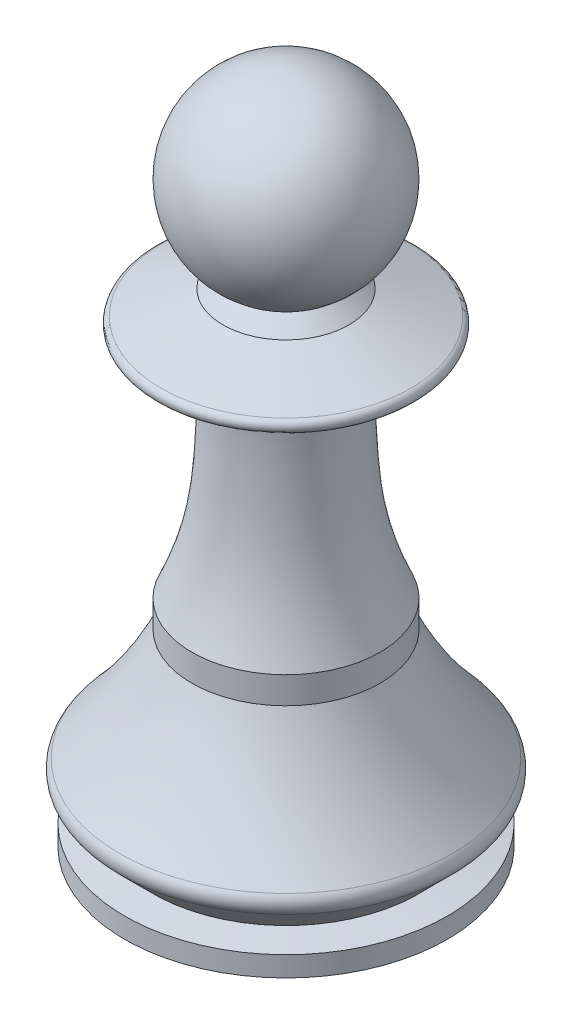
ISO-10303-21;
HEADER;
FILE_DESCRIPTION(('STEP AP214'),'2;1');
FILE_NAME('part.step','',(''),(''),'','','');
FILE_SCHEMA(('AUTOMOTIVE_DESIGN { 1 0 10303 214 1 1 1 1 }'));
ENDSEC;
DATA;
#1=APPLICATION_CONTEXT('core data for automotive mechanical design processes');
#2=APPLICATION_PROTOCOL_DEFINITION('international standard','automotive_design',2000,#1);
#3=PRODUCT_CONTEXT('',#1,'mechanical');
#4=PRODUCT('Part','Part','',(#3));
#5=PRODUCT_RELATED_PRODUCT_CATEGORY('part','',(#4));
#6=PRODUCT_DEFINITION_FORMATION('','',#4);
#7=PRODUCT_DEFINITION_CONTEXT('part definition',#1,'design');
#8=PRODUCT_DEFINITION('design','',#6,#7);
#9=PRODUCT_DEFINITION_SHAPE('','',#8);
#10=(LENGTH_UNIT() NAMED_UNIT(*) SI_UNIT(.MILLI.,.METRE.));
#11=(NAMED_UNIT(*) PLANE_ANGLE_UNIT() SI_UNIT($,.RADIAN.));
#12=(NAMED_UNIT(*) SI_UNIT($,.STERADIAN.) SOLID_ANGLE_UNIT());
#13=UNCERTAINTY_MEASURE_WITH_UNIT(LENGTH_MEASURE(1.E-05),#10,'distance_accuracy_value','');
#14=(GEOMETRIC_REPRESENTATION_CONTEXT(3) GLOBAL_UNCERTAINTY_ASSIGNED_CONTEXT((#13)) GLOBAL_UNIT_ASSIGNED_CONTEXT((#10,
#11,#12)) REPRESENTATION_CONTEXT('',''));
#15=CARTESIAN_POINT('',(0.,0.,0.));
#16=DIRECTION('',(0.,0.,1.));
#17=DIRECTION('',(1.,0.,0.));
#18=AXIS2_PLACEMENT_3D('',#15,#16,#17);
#19=CARTESIAN_POINT('',(0.,0.,0.));
#20=DIRECTION('',(0.,-1.,0.));
#21=DIRECTION('',(0.,0.,-1.));
#22=AXIS2_PLACEMENT_3D('',#19,#20,#21);
#23=PLANE('',#22);
#24=CARTESIAN_POINT('',(0.,0.,0.));
#25=DIRECTION('',(0.,-1.,0.));
#26=DIRECTION('',(0.,0.,-1.));
#27=AXIS2_PLACEMENT_3D('',#24,#25,#26);
#28=CIRCLE('',#27,12.);
#29=CARTESIAN_POINT('',(0.,0.,-12.));
#30=VERTEX_POINT('',#29);
#31=EDGE_CURVE('E71',#30,#30,#28,.T.);
#32=ORIENTED_EDGE('',*,*,#31,.T.);
#33=EDGE_LOOP('',(#32));
#34=FACE_BOUND('',#33,.T.);
#35=ADVANCED_FACE('F30',(#34),#23,.T.);
#36=CARTESIAN_POINT('',(0.,43.,0.));
#37=DIRECTION('',(0.,-1.,0.));
#38=DIRECTION('',(1.,0.,0.));
#39=AXIS2_PLACEMENT_3D('',#36,#37,#38);
#40=SPHERICAL_SURFACE('',#39,7.);
#41=CARTESIAN_POINT('',(0.,36.9378221735089,0.));
#42=DIRECTION('',(0.,-1.,0.));
#43=DIRECTION('',(0.,0.,-1.));
#44=AXIS2_PLACEMENT_3D('',#41,#42,#43);
#45=CIRCLE('',#44,3.49999999999996);
#46=CARTESIAN_POINT('',(0.,36.9378221735089,-3.49999999999996));
#47=VERTEX_POINT('',#46);
#48=EDGE_CURVE('E50',#47,#47,#45,.T.);
#49=ORIENTED_EDGE('',*,*,#48,.F.);
#50=EDGE_LOOP('',(#49));
#51=FACE_BOUND('',#50,.T.);
#52=ADVANCED_FACE('F101',(#51),#40,.T.);
#53=CARTESIAN_POINT('',(0.,35.9378221735089,0.));
#54=DIRECTION('',(0.,-1.,0.));
#55=DIRECTION('',(0.,0.,-1.));
#56=AXIS2_PLACEMENT_3D('',#53,#54,#55);
#57=CONICAL_SURFACE('',#56,4.69175359259417,0.872664625997163);
#58=ORIENTED_EDGE('',*,*,#48,.T.);
#59=EDGE_LOOP('',(#58));
#60=FACE_BOUND('',#59,.T.);
#61=CARTESIAN_POINT('',(0.,35.9378221735089,0.));
#62=DIRECTION('',(0.,-1.,0.));
#63=DIRECTION('',(0.,0.,-1.));
#64=AXIS2_PLACEMENT_3D('',#61,#62,#63);
#65=CIRCLE('',#64,4.69175359259417);
#66=CARTESIAN_POINT('',(0.,35.9378221735089,-4.69175359259417));
#67=VERTEX_POINT('',#66);
#68=EDGE_CURVE('E53',#67,#67,#65,.T.);
#69=ORIENTED_EDGE('',*,*,#68,.F.);
#70=EDGE_LOOP('',(#69));
#71=FACE_BOUND('',#70,.T.);
#72=ADVANCED_FACE('F98',(#60,#71),#57,.T.);
#73=CARTESIAN_POINT('',(0.,33.5,0.));
#74=DIRECTION('',(0.,-1.,0.));
#75=DIRECTION('',(0.,0.,-1.));
#76=AXIS2_PLACEMENT_3D('',#73,#74,#75);
#77=CONICAL_SURFACE('',#76,11.,1.20202523206501);
#78=CARTESIAN_POINT('',(0.,34.1590225925414,0.));
#79=DIRECTION('',(0.,1.,0.));
#80=DIRECTION('',(0.,0.,1.));
#81=AXIS2_PLACEMENT_3D('',#78,#79,#80);
#82=CIRCLE('',#81,9.29467590090264);
#83=CARTESIAN_POINT('',(0.,34.1590225925414,9.29467590090264));
#84=VERTEX_POINT('',#83);
#85=EDGE_CURVE('E10',#84,#84,#82,.T.);
#86=ORIENTED_EDGE('',*,*,#85,.T.);
#87=EDGE_LOOP('',(#86));
#88=FACE_BOUND('',#87,.T.);
#89=ORIENTED_EDGE('',*,*,#68,.T.);
#90=EDGE_LOOP('',(#89));
#91=FACE_BOUND('',#90,.T.);
#92=ADVANCED_FACE('F95',(#88,#91),#77,.T.);
#93=CARTESIAN_POINT('',(0.,32.5,0.));
#94=DIRECTION('',(0.,1.,0.));
#95=DIRECTION('',(0.,0.,1.));
#96=AXIS2_PLACEMENT_3D('',#93,#94,#95);
#97=CONICAL_SURFACE('',#96,5.,1.40564764938027);
#98=CARTESIAN_POINT('',(0.,33.1994401143253,0.));
#99=DIRECTION('',(0.,-1.,0.));
#100=DIRECTION('',(0.,0.,-1.));
#101=AXIS2_PLACEMENT_3D('',#98,#99,#100);
#102=CIRCLE('',#101,9.19664068595152);
#103=CARTESIAN_POINT('',(0.,33.1994401143253,-9.19664068595152));
#104=VERTEX_POINT('',#103);
#105=EDGE_CURVE('E37',#104,#104,#102,.T.);
#106=ORIENTED_EDGE('',*,*,#105,.T.);
#107=EDGE_LOOP('',(#106));
#108=FACE_BOUND('',#107,.T.);
#109=CARTESIAN_POINT('',(0.,32.5,0.));
#110=DIRECTION('',(0.,-1.,0.));
#111=DIRECTION('',(0.,0.,-1.));
#112=AXIS2_PLACEMENT_3D('',#109,#110,#111);
#113=CIRCLE('',#112,5.);
#114=CARTESIAN_POINT('',(0.,32.5,-5.));
#115=VERTEX_POINT('',#114);
#116=EDGE_CURVE('E56',#115,#115,#113,.T.);
#117=ORIENTED_EDGE('',*,*,#116,.F.);
#118=EDGE_LOOP('',(#117));
#119=FACE_BOUND('',#118,.T.);
#120=ADVANCED_FACE('F90',(#108,#119),#97,.T.);
#121=CARTESIAN_POINT('',(7.,16.,0.));
#122=CARTESIAN_POINT('',(5.30369793975615,19.8693220342366,0.));
#123=CARTESIAN_POINT('',(4.76008901213303,24.4104739884962,0.));
#124=CARTESIAN_POINT('',(4.6325643020975,30.3602489897691,0.));
#125=CARTESIAN_POINT('',(5.,32.5,0.));
#126=B_SPLINE_CURVE_WITH_KNOTS('',3,(#121,#122,#123,#124,#125),.UNSPECIFIED.,.F.,.F.,(4,1,4),
(0.,0.606961711379506,1.),.UNSPECIFIED.);
#127=CARTESIAN_POINT('',(0.,0.,0.));
#128=DIRECTION('',(0.,-1.,0.));
#129=AXIS1_PLACEMENT('',#127,#128);
#130=SURFACE_OF_REVOLUTION('',#126,#129);
#131=ORIENTED_EDGE('',*,*,#116,.T.);
#132=EDGE_LOOP('',(#131));
#133=FACE_BOUND('',#132,.T.);
#134=CARTESIAN_POINT('',(0.,16.,0.));
#135=DIRECTION('',(0.,-1.,0.));
#136=DIRECTION('',(0.,0.,-1.));
#137=AXIS2_PLACEMENT_3D('',#134,#135,#136);
#138=CIRCLE('',#137,7.);
#139=CARTESIAN_POINT('',(0.,16.,-7.));
#140=VERTEX_POINT('',#139);
#141=EDGE_CURVE('E59',#140,#140,#138,.T.);
#142=ORIENTED_EDGE('',*,*,#141,.F.);
#143=EDGE_LOOP('',(#142));
#144=FACE_BOUND('',#143,.T.);
#145=ADVANCED_FACE('F85',(#133,#144),#130,.F.);
#146=CARTESIAN_POINT('',(0.,0.,0.));
#147=DIRECTION('',(0.,-1.,0.));
#148=DIRECTION('',(0.,0.,-1.));
#149=AXIS2_PLACEMENT_3D('',#146,#147,#148);
#150=CYLINDRICAL_SURFACE('',#149,7.);
#151=ORIENTED_EDGE('',*,*,#141,.T.);
#152=EDGE_LOOP('',(#151));
#153=FACE_BOUND('',#152,.T.);
#154=CARTESIAN_POINT('',(0.,14.,0.));
#155=DIRECTION('',(0.,-1.,0.));
#156=DIRECTION('',(0.,0.,-1.));
#157=AXIS2_PLACEMENT_3D('',#154,#155,#156);
#158=CIRCLE('',#157,7.);
#159=CARTESIAN_POINT('',(0.,14.,-7.));
#160=VERTEX_POINT('',#159);
#161=EDGE_CURVE('E62',#160,#160,#158,.T.);
#162=ORIENTED_EDGE('',*,*,#161,.F.);
#163=EDGE_LOOP('',(#162));
#164=FACE_BOUND('',#163,.T.);
#165=ADVANCED_FACE('F89',(#153,#164),#150,.T.);
#166=CARTESIAN_POINT('',(13.,5.,0.));
#167=CARTESIAN_POINT('',(9.17876167077522,9.00504331489296,0.));
#168=CARTESIAN_POINT('',(7.,14.,0.));
#169=B_SPLINE_CURVE_WITH_KNOTS('',2,(#166,#167,#168),.UNSPECIFIED.,.F.,.F.,(3,3),(0.,1.),.UNSPECIFIED.);
#170=CARTESIAN_POINT('',(0.,0.,0.));
#171=DIRECTION('',(0.,-1.,0.));
#172=AXIS1_PLACEMENT('',#170,#171);
#173=SURFACE_OF_REVOLUTION('',#169,#172);
#174=CARTESIAN_POINT('',(0.,5.6953548213698,0.));
#175=DIRECTION('',(0.,-1.,0.));
#176=DIRECTION('',(0.,0.,-1.));
#177=AXIS2_PLACEMENT_3D('',#174,#175,#176);
#178=CIRCLE('',#177,12.3556451771667);
#179=CARTESIAN_POINT('',(0.,5.6953548213698,-12.3556451771667));
#180=VERTEX_POINT('',#179);
#181=EDGE_CURVE('E41',#180,#180,#178,.F.);
#182=ORIENTED_EDGE('',*,*,#181,.T.);
#183=EDGE_LOOP('',(#182));
#184=FACE_BOUND('',#183,.T.);
#185=ORIENTED_EDGE('',*,*,#161,.T.);
#186=EDGE_LOOP('',(#185));
#187=FACE_BOUND('',#186,.T.);
#188=ADVANCED_FACE('F127',(#184,#187),#173,.F.);
#189=CARTESIAN_POINT('',(0.,1.87474057723786,0.));
#190=DIRECTION('',(0.,1.,0.));
#191=DIRECTION('',(0.,0.,1.));
#192=AXIS2_PLACEMENT_3D('',#189,#190,#191);
#193=CONICAL_SURFACE('',#192,9.87474057723785,0.785398163397449);
#194=CARTESIAN_POINT('',(0.,4.31937515793751,0.));
#195=DIRECTION('',(0.,-1.,0.));
#196=DIRECTION('',(0.,0.,-1.));
#197=AXIS2_PLACEMENT_3D('',#194,#195,#196);
#198=CIRCLE('',#197,12.3193751579375);
#199=CARTESIAN_POINT('',(0.,4.31937515793751,-12.3193751579375));
#200=VERTEX_POINT('',#199);
#201=EDGE_CURVE('E45',#200,#200,#198,.T.);
#202=ORIENTED_EDGE('',*,*,#201,.T.);
#203=EDGE_LOOP('',(#202));
#204=FACE_BOUND('',#203,.T.);
#205=CARTESIAN_POINT('',(0.,1.87474057723786,0.));
#206=DIRECTION('',(0.,-1.,0.));
#207=DIRECTION('',(0.,0.,-1.));
#208=AXIS2_PLACEMENT_3D('',#205,#206,#207);
#209=CIRCLE('',#208,9.87474057723785);
#210=CARTESIAN_POINT('',(0.,1.87474057723786,-9.87474057723785));
#211=VERTEX_POINT('',#210);
#212=EDGE_CURVE('E65',#211,#211,#209,.T.);
#213=ORIENTED_EDGE('',*,*,#212,.F.);
#214=EDGE_LOOP('',(#213));
#215=FACE_BOUND('',#214,.T.);
#216=ADVANCED_FACE('F124',(#204,#215),#193,.T.);
#217=CARTESIAN_POINT('',(0.,1.5,0.));
#218=DIRECTION('',(0.,-1.,0.));
#219=DIRECTION('',(0.,0.,-1.));
#220=AXIS2_PLACEMENT_3D('',#217,#218,#219);
#221=CONICAL_SURFACE('',#220,12.,1.39626340159547);
#222=ORIENTED_EDGE('',*,*,#212,.T.);
#223=EDGE_LOOP('',(#222));
#224=FACE_BOUND('',#223,.T.);
#225=CARTESIAN_POINT('',(0.,1.5,0.));
#226=DIRECTION('',(0.,-1.,0.));
#227=DIRECTION('',(0.,0.,-1.));
#228=AXIS2_PLACEMENT_3D('',#225,#226,#227);
#229=CIRCLE('',#228,12.);
#230=CARTESIAN_POINT('',(0.,1.5,-12.));
#231=VERTEX_POINT('',#230);
#232=EDGE_CURVE('E68',#231,#231,#229,.T.);
#233=ORIENTED_EDGE('',*,*,#232,.F.);
#234=EDGE_LOOP('',(#233));
#235=FACE_BOUND('',#234,.T.);
#236=ADVANCED_FACE('F117',(#224,#235),#221,.T.);
#237=CARTESIAN_POINT('',(0.,0.,0.));
#238=DIRECTION('',(0.,-1.,0.));
#239=DIRECTION('',(0.,0.,-1.));
#240=AXIS2_PLACEMENT_3D('',#237,#238,#239);
#241=CYLINDRICAL_SURFACE('',#240,12.);
#242=ORIENTED_EDGE('',*,*,#232,.T.);
#243=EDGE_LOOP('',(#242));
#244=FACE_BOUND('',#243,.T.);
#245=ORIENTED_EDGE('',*,*,#31,.F.);
#246=EDGE_LOOP('',(#245));
#247=FACE_BOUND('',#246,.T.);
#248=ADVANCED_FACE('F110',(#244,#247),#241,.T.);
#249=CARTESIAN_POINT('',(0.,5.02648193912406,0.));
#250=DIRECTION('',(0.,1.,0.));
#251=DIRECTION('',(0.,0.,1.));
#252=AXIS2_PLACEMENT_3D('',#249,#250,#251);
#253=TOROIDAL_SURFACE('',#252,11.612268376751,1.);
#254=ORIENTED_EDGE('',*,*,#181,.F.);
#255=EDGE_LOOP('',(#254));
#256=FACE_BOUND('',#255,.T.);
#257=ORIENTED_EDGE('',*,*,#201,.F.);
#258=EDGE_LOOP('',(#257));
#259=FACE_BOUND('',#258,.T.);
#260=ADVANCED_FACE('F108',(#256,#259),#253,.T.);
#261=CARTESIAN_POINT('',(0.,33.6926370762413,0.));
#262=DIRECTION('',(0.,1.,0.));
#263=DIRECTION('',(0.,0.,1.));
#264=AXIS2_PLACEMENT_3D('',#261,#262,#263);
#265=TOROIDAL_SURFACE('',#264,9.11444119229884,0.5);
#266=ORIENTED_EDGE('',*,*,#85,.F.);
#267=EDGE_LOOP('',(#266));
#268=FACE_BOUND('',#267,.T.);
#269=ORIENTED_EDGE('',*,*,#105,.F.);
#270=EDGE_LOOP('',(#269));
#271=FACE_BOUND('',#270,.T.);
#272=ADVANCED_FACE('F32',(#268,#271),#265,.T.);
#273=CLOSED_SHELL('',(#35,#52,#72,#92,#120,#145,#165,#188,#216,#236,#248,#260,#272));
#274=MANIFOLD_SOLID_BREP('B2',#273);
#275=ADVANCED_BREP_SHAPE_REPRESENTATION('',(#18,#274),#14);
#276=SHAPE_DEFINITION_REPRESENTATION(#9,#275);
ENDSEC;
END-ISO-10303-21;
